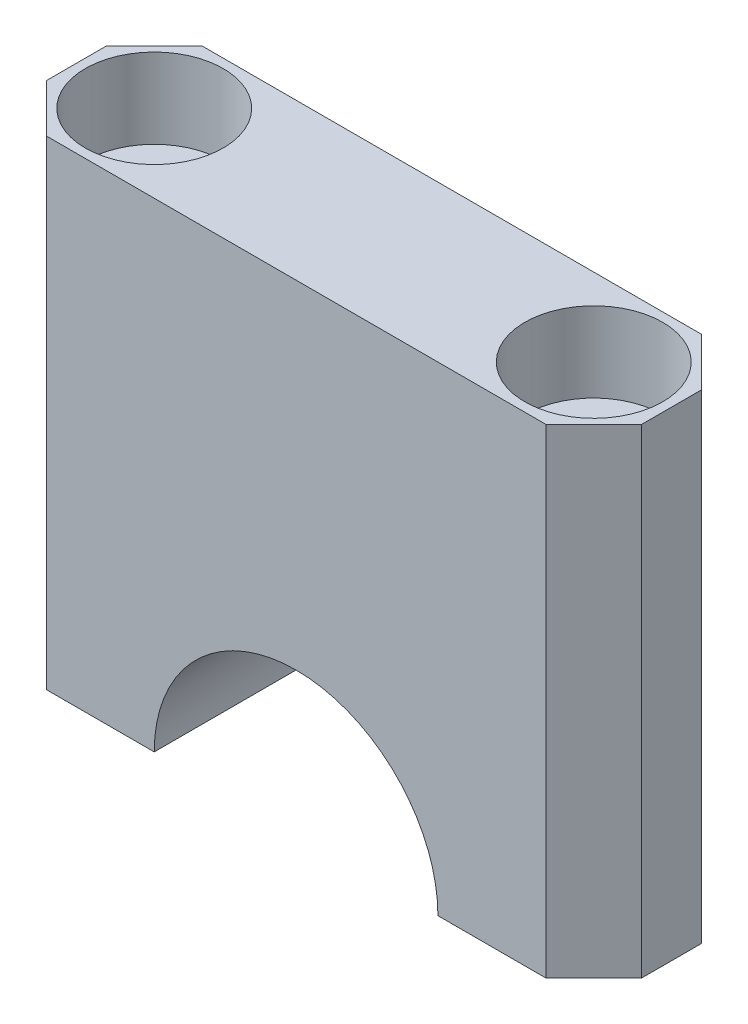
ISO-10303-21;
HEADER;
FILE_DESCRIPTION(('STEP AP214'),'2;1');
FILE_NAME('part.step','',(''),(''),'','','');
FILE_SCHEMA(('AUTOMOTIVE_DESIGN { 1 0 10303 214 1 1 1 1 }'));
ENDSEC;
DATA;
#1=APPLICATION_CONTEXT('core data for automotive mechanical design processes');
#2=APPLICATION_PROTOCOL_DEFINITION('international standard','automotive_design',2000,#1);
#3=PRODUCT_CONTEXT('',#1,'mechanical');
#4=PRODUCT('Part','Part','',(#3));
#5=PRODUCT_RELATED_PRODUCT_CATEGORY('part','',(#4));
#6=PRODUCT_DEFINITION_FORMATION('','',#4);
#7=PRODUCT_DEFINITION_CONTEXT('part definition',#1,'design');
#8=PRODUCT_DEFINITION('design','',#6,#7);
#9=PRODUCT_DEFINITION_SHAPE('','',#8);
#10=(LENGTH_UNIT() NAMED_UNIT(*) SI_UNIT(.MILLI.,.METRE.));
#11=(NAMED_UNIT(*) PLANE_ANGLE_UNIT() SI_UNIT($,.RADIAN.));
#12=(NAMED_UNIT(*) SI_UNIT($,.STERADIAN.) SOLID_ANGLE_UNIT());
#13=UNCERTAINTY_MEASURE_WITH_UNIT(LENGTH_MEASURE(1.E-05),#10,'distance_accuracy_value','');
#14=(GEOMETRIC_REPRESENTATION_CONTEXT(3) GLOBAL_UNCERTAINTY_ASSIGNED_CONTEXT((#13)) GLOBAL_UNIT_ASSIGNED_CONTEXT((#10,
#11,#12)) REPRESENTATION_CONTEXT('',''));
#15=CARTESIAN_POINT('',(0.,0.,0.));
#16=DIRECTION('',(0.,0.,1.));
#17=DIRECTION('',(1.,0.,0.));
#18=AXIS2_PLACEMENT_3D('',#15,#16,#17);
#19=CARTESIAN_POINT('',(-11.,-24.,0.));
#20=DIRECTION('',(0.,1.,0.));
#21=DIRECTION('',(0.,0.,1.));
#22=AXIS2_PLACEMENT_3D('',#19,#20,#21);
#23=CYLINDRICAL_SURFACE('',#22,2.1);
#24=CARTESIAN_POINT('',(-11.,-24.,0.));
#25=DIRECTION('',(0.,1.,0.));
#26=DIRECTION('',(0.,0.,1.));
#27=AXIS2_PLACEMENT_3D('',#24,#25,#26);
#28=CIRCLE('',#27,2.1);
#29=CARTESIAN_POINT('',(-11.,-24.,2.1));
#30=VERTEX_POINT('',#29);
#31=EDGE_CURVE('E155',#30,#30,#28,.T.);
#32=ORIENTED_EDGE('',*,*,#31,.F.);
#33=EDGE_LOOP('',(#32));
#34=FACE_BOUND('',#33,.T.);
#35=CARTESIAN_POINT('',(-11.,-4.,0.));
#36=DIRECTION('',(0.,1.,0.));
#37=DIRECTION('',(0.,0.,1.));
#38=AXIS2_PLACEMENT_3D('',#35,#36,#37);
#39=CIRCLE('',#38,2.1);
#40=CARTESIAN_POINT('',(-11.,-4.,2.1));
#41=VERTEX_POINT('',#40);
#42=EDGE_CURVE('E41',#41,#41,#39,.F.);
#43=ORIENTED_EDGE('',*,*,#42,.F.);
#44=EDGE_LOOP('',(#43));
#45=FACE_BOUND('',#44,.T.);
#46=ADVANCED_FACE('F37',(#34,#45),#23,.F.);
#47=CARTESIAN_POINT('',(0.,-24.,0.));
#48=DIRECTION('',(0.,-1.,0.));
#49=DIRECTION('',(0.,0.,-1.));
#50=AXIS2_PLACEMENT_3D('',#47,#48,#49);
#51=PLANE('',#50);
#52=DIRECTION('',(0.,0.,-1.));
#53=VECTOR('',#52,1.);
#54=CARTESIAN_POINT('',(-7.1,-24.,3.90100000000002));
#55=LINE('',#54,#53);
#56=CARTESIAN_POINT('',(-7.1,-24.,3.90000000000001));
#57=VERTEX_POINT('',#56);
#58=CARTESIAN_POINT('',(-7.1,-24.,-3.9));
#59=VERTEX_POINT('',#58);
#60=EDGE_CURVE('E205',#57,#59,#55,.T.);
#61=ORIENTED_EDGE('',*,*,#60,.F.);
#62=DIRECTION('',(1.,0.,0.));
#63=VECTOR('',#62,1.);
#64=CARTESIAN_POINT('',(12.5,-24.,3.90000000000001));
#65=LINE('',#64,#63);
#66=CARTESIAN_POINT('',(-12.5,-24.,3.90000000000002));
#67=VERTEX_POINT('',#66);
#68=EDGE_CURVE('E213',#67,#57,#65,.T.);
#69=ORIENTED_EDGE('',*,*,#68,.F.);
#70=DIRECTION('',(0.707106781186545,0.,0.70710678118655));
#71=VECTOR('',#70,1.);
#72=CARTESIAN_POINT('',(-14.9,-24.,1.5));
#73=LINE('',#72,#71);
#74=CARTESIAN_POINT('',(-14.9,-24.,1.5));
#75=VERTEX_POINT('',#74);
#76=EDGE_CURVE('E138',#75,#67,#73,.T.);
#77=ORIENTED_EDGE('',*,*,#76,.F.);
#78=DIRECTION('',(0.,0.,1.));
#79=VECTOR('',#78,1.);
#80=CARTESIAN_POINT('',(-14.9,-24.,1.5));
#81=LINE('',#80,#79);
#82=CARTESIAN_POINT('',(-14.9,-24.,-1.5));
#83=VERTEX_POINT('',#82);
#84=EDGE_CURVE('E121',#83,#75,#81,.T.);
#85=ORIENTED_EDGE('',*,*,#84,.F.);
#86=DIRECTION('',(-0.707106781186547,0.,0.707106781186548));
#87=VECTOR('',#86,1.);
#88=CARTESIAN_POINT('',(-14.9,-24.,-1.5));
#89=LINE('',#88,#87);
#90=CARTESIAN_POINT('',(-12.5,-24.,-3.9));
#91=VERTEX_POINT('',#90);
#92=EDGE_CURVE('E137',#91,#83,#89,.T.);
#93=ORIENTED_EDGE('',*,*,#92,.F.);
#94=DIRECTION('',(-1.,0.,0.));
#95=VECTOR('',#94,1.);
#96=CARTESIAN_POINT('',(12.5,-24.,-3.90000000000001));
#97=LINE('',#96,#95);
#98=EDGE_CURVE('E145',#59,#91,#97,.T.);
#99=ORIENTED_EDGE('',*,*,#98,.F.);
#100=EDGE_LOOP('',(#61,#69,#77,#85,#93,#99));
#101=FACE_BOUND('',#100,.T.);
#102=ORIENTED_EDGE('',*,*,#31,.T.);
#103=EDGE_LOOP('',(#102));
#104=FACE_BOUND('',#103,.T.);
#105=ADVANCED_FACE('F134',(#101,#104),#51,.T.);
#106=CARTESIAN_POINT('',(12.5,-24.,3.90000000000001));
#107=DIRECTION('',(0.,0.,1.));
#108=DIRECTION('',(1.,0.,0.));
#109=AXIS2_PLACEMENT_3D('',#106,#107,#108);
#110=PLANE('',#109);
#111=CARTESIAN_POINT('',(0.,-24.,3.90000000000001));
#112=DIRECTION('',(0.,0.,1.));
#113=DIRECTION('',(1.,0.,0.));
#114=AXIS2_PLACEMENT_3D('',#111,#112,#113);
#115=CIRCLE('',#114,7.1);
#116=CARTESIAN_POINT('',(7.1,-24.,3.90000000000001));
#117=VERTEX_POINT('',#116);
#118=EDGE_CURVE('E187',#57,#117,#115,.F.);
#119=ORIENTED_EDGE('',*,*,#118,.T.);
#120=CARTESIAN_POINT('',(12.5,-24.,3.90000000000001));
#121=VERTEX_POINT('',#120);
#122=EDGE_CURVE('E99',#117,#121,#65,.T.);
#123=ORIENTED_EDGE('',*,*,#122,.T.);
#124=DIRECTION('',(0.,1.,0.));
#125=VECTOR('',#124,1.);
#126=CARTESIAN_POINT('',(12.5,-24.,3.90000000000001));
#127=LINE('',#126,#125);
#128=CARTESIAN_POINT('',(12.5,0.,3.90000000000001));
#129=VERTEX_POINT('',#128);
#130=EDGE_CURVE('E150',#121,#129,#127,.T.);
#131=ORIENTED_EDGE('',*,*,#130,.T.);
#132=DIRECTION('',(1.,0.,0.));
#133=VECTOR('',#132,1.);
#134=CARTESIAN_POINT('',(12.5,0.,3.90000000000001));
#135=LINE('',#134,#133);
#136=CARTESIAN_POINT('',(-12.5,0.,3.90000000000002));
#137=VERTEX_POINT('',#136);
#138=EDGE_CURVE('E151',#137,#129,#135,.T.);
#139=ORIENTED_EDGE('',*,*,#138,.F.);
#140=DIRECTION('',(0.,1.,0.));
#141=VECTOR('',#140,1.);
#142=CARTESIAN_POINT('',(-12.5,-24.,3.90000000000002));
#143=LINE('',#142,#141);
#144=EDGE_CURVE('E11',#67,#137,#143,.T.);
#145=ORIENTED_EDGE('',*,*,#144,.F.);
#146=ORIENTED_EDGE('',*,*,#68,.T.);
#147=EDGE_LOOP('',(#119,#123,#131,#139,#145,#146));
#148=FACE_BOUND('',#147,.T.);
#149=ADVANCED_FACE('F39',(#148),#110,.T.);
#150=CARTESIAN_POINT('',(-14.9,-24.,1.5));
#151=DIRECTION('',(-0.707106781186549,0.,0.707106781186545));
#152=DIRECTION('',(0.707106781186545,0.,0.70710678118655));
#153=AXIS2_PLACEMENT_3D('',#150,#151,#152);
#154=PLANE('',#153);
#155=DIRECTION('',(0.707106781186545,0.,0.70710678118655));
#156=VECTOR('',#155,1.);
#157=CARTESIAN_POINT('',(-14.9,0.,1.5));
#158=LINE('',#157,#156);
#159=CARTESIAN_POINT('',(-14.9,0.,1.5));
#160=VERTEX_POINT('',#159);
#161=EDGE_CURVE('E170',#160,#137,#158,.T.);
#162=ORIENTED_EDGE('',*,*,#161,.F.);
#163=DIRECTION('',(0.,1.,0.));
#164=VECTOR('',#163,1.);
#165=CARTESIAN_POINT('',(-14.9,-24.,1.5));
#166=LINE('',#165,#164);
#167=EDGE_CURVE('E46',#75,#160,#166,.T.);
#168=ORIENTED_EDGE('',*,*,#167,.F.);
#169=ORIENTED_EDGE('',*,*,#76,.T.);
#170=ORIENTED_EDGE('',*,*,#144,.T.);
#171=EDGE_LOOP('',(#162,#168,#169,#170));
#172=FACE_BOUND('',#171,.T.);
#173=ADVANCED_FACE('F244',(#172),#154,.T.);
#174=CARTESIAN_POINT('',(-14.9,-24.,1.5));
#175=DIRECTION('',(-1.,0.,0.));
#176=DIRECTION('',(0.,0.,1.));
#177=AXIS2_PLACEMENT_3D('',#174,#175,#176);
#178=PLANE('',#177);
#179=DIRECTION('',(0.,0.,1.));
#180=VECTOR('',#179,1.);
#181=CARTESIAN_POINT('',(-14.9,0.,1.5));
#182=LINE('',#181,#180);
#183=CARTESIAN_POINT('',(-14.9,0.,-1.5));
#184=VERTEX_POINT('',#183);
#185=EDGE_CURVE('E124',#184,#160,#182,.T.);
#186=ORIENTED_EDGE('',*,*,#185,.F.);
#187=DIRECTION('',(0.,1.,0.));
#188=VECTOR('',#187,1.);
#189=CARTESIAN_POINT('',(-14.9,-24.,-1.5));
#190=LINE('',#189,#188);
#191=EDGE_CURVE('E118',#83,#184,#190,.T.);
#192=ORIENTED_EDGE('',*,*,#191,.F.);
#193=ORIENTED_EDGE('',*,*,#84,.T.);
#194=ORIENTED_EDGE('',*,*,#167,.T.);
#195=EDGE_LOOP('',(#186,#192,#193,#194));
#196=FACE_BOUND('',#195,.T.);
#197=ADVANCED_FACE('F120',(#196),#178,.T.);
#198=CARTESIAN_POINT('',(-14.9,-24.,-1.5));
#199=DIRECTION('',(-0.707106781186548,0.,-0.707106781186547));
#200=DIRECTION('',(-0.707106781186547,0.,0.707106781186548));
#201=AXIS2_PLACEMENT_3D('',#198,#199,#200);
#202=PLANE('',#201);
#203=DIRECTION('',(-0.707106781186547,0.,0.707106781186548));
#204=VECTOR('',#203,1.);
#205=CARTESIAN_POINT('',(-14.9,0.,-1.5));
#206=LINE('',#205,#204);
#207=CARTESIAN_POINT('',(-12.5,0.,-3.9));
#208=VERTEX_POINT('',#207);
#209=EDGE_CURVE('E167',#208,#184,#206,.T.);
#210=ORIENTED_EDGE('',*,*,#209,.F.);
#211=DIRECTION('',(0.,1.,0.));
#212=VECTOR('',#211,1.);
#213=CARTESIAN_POINT('',(-12.5,-24.,-3.9));
#214=LINE('',#213,#212);
#215=EDGE_CURVE('E129',#91,#208,#214,.T.);
#216=ORIENTED_EDGE('',*,*,#215,.F.);
#217=ORIENTED_EDGE('',*,*,#92,.T.);
#218=ORIENTED_EDGE('',*,*,#191,.T.);
#219=EDGE_LOOP('',(#210,#216,#217,#218));
#220=FACE_BOUND('',#219,.T.);
#221=ADVANCED_FACE('F141',(#220),#202,.T.);
#222=CARTESIAN_POINT('',(12.5,-24.,-3.90000000000001));
#223=DIRECTION('',(0.,0.,-1.));
#224=DIRECTION('',(-1.,0.,0.));
#225=AXIS2_PLACEMENT_3D('',#222,#223,#224);
#226=PLANE('',#225);
#227=CARTESIAN_POINT('',(0.,-24.,-3.9));
#228=DIRECTION('',(0.,0.,-1.));
#229=DIRECTION('',(-1.,0.,0.));
#230=AXIS2_PLACEMENT_3D('',#227,#228,#229);
#231=CIRCLE('',#230,7.1);
#232=CARTESIAN_POINT('',(7.1,-24.,-3.9));
#233=VERTEX_POINT('',#232);
#234=EDGE_CURVE('E54',#59,#233,#231,.T.);
#235=ORIENTED_EDGE('',*,*,#234,.F.);
#236=ORIENTED_EDGE('',*,*,#98,.T.);
#237=ORIENTED_EDGE('',*,*,#215,.T.);
#238=DIRECTION('',(-1.,0.,0.));
#239=VECTOR('',#238,1.);
#240=CARTESIAN_POINT('',(12.5,0.,-3.90000000000001));
#241=LINE('',#240,#239);
#242=CARTESIAN_POINT('',(12.5,0.,-3.90000000000001));
#243=VERTEX_POINT('',#242);
#244=EDGE_CURVE('E164',#243,#208,#241,.T.);
#245=ORIENTED_EDGE('',*,*,#244,.F.);
#246=DIRECTION('',(0.,1.,0.));
#247=VECTOR('',#246,1.);
#248=CARTESIAN_POINT('',(12.5,-24.,-3.90000000000001));
#249=LINE('',#248,#247);
#250=CARTESIAN_POINT('',(12.5,-24.,-3.90000000000001));
#251=VERTEX_POINT('',#250);
#252=EDGE_CURVE('E175',#251,#243,#249,.T.);
#253=ORIENTED_EDGE('',*,*,#252,.F.);
#254=EDGE_CURVE('E142',#251,#233,#97,.T.);
#255=ORIENTED_EDGE('',*,*,#254,.T.);
#256=EDGE_LOOP('',(#235,#236,#237,#245,#253,#255));
#257=FACE_BOUND('',#256,.T.);
#258=ADVANCED_FACE('F225',(#257),#226,.T.);
#259=CARTESIAN_POINT('',(14.9,-24.,-1.5));
#260=DIRECTION('',(0.707106781186548,0.,-0.707106781186546));
#261=DIRECTION('',(-0.707106781186547,0.,-0.707106781186549));
#262=AXIS2_PLACEMENT_3D('',#259,#260,#261);
#263=PLANE('',#262);
#264=DIRECTION('',(-0.707106781186547,0.,-0.707106781186549));
#265=VECTOR('',#264,1.);
#266=CARTESIAN_POINT('',(14.9,0.,-1.5));
#267=LINE('',#266,#265);
#268=CARTESIAN_POINT('',(14.9,0.,-1.5));
#269=VERTEX_POINT('',#268);
#270=EDGE_CURVE('E161',#269,#243,#267,.T.);
#271=ORIENTED_EDGE('',*,*,#270,.F.);
#272=DIRECTION('',(0.,1.,0.));
#273=VECTOR('',#272,1.);
#274=CARTESIAN_POINT('',(14.9,-24.,-1.5));
#275=LINE('',#274,#273);
#276=CARTESIAN_POINT('',(14.9,-24.,-1.5));
#277=VERTEX_POINT('',#276);
#278=EDGE_CURVE('E177',#277,#269,#275,.T.);
#279=ORIENTED_EDGE('',*,*,#278,.F.);
#280=DIRECTION('',(-0.707106781186547,0.,-0.707106781186549));
#281=VECTOR('',#280,1.);
#282=CARTESIAN_POINT('',(14.9,-24.,-1.5));
#283=LINE('',#282,#281);
#284=EDGE_CURVE('E220',#277,#251,#283,.T.);
#285=ORIENTED_EDGE('',*,*,#284,.T.);
#286=ORIENTED_EDGE('',*,*,#252,.T.);
#287=EDGE_LOOP('',(#271,#279,#285,#286));
#288=FACE_BOUND('',#287,.T.);
#289=ADVANCED_FACE('F361',(#288),#263,.T.);
#290=CARTESIAN_POINT('',(14.9,-24.,-1.5));
#291=DIRECTION('',(1.,0.,0.));
#292=DIRECTION('',(0.,0.,-1.));
#293=AXIS2_PLACEMENT_3D('',#290,#291,#292);
#294=PLANE('',#293);
#295=DIRECTION('',(0.,0.,-1.));
#296=VECTOR('',#295,1.);
#297=CARTESIAN_POINT('',(14.9,0.,-1.5));
#298=LINE('',#297,#296);
#299=CARTESIAN_POINT('',(14.9,0.,1.5));
#300=VERTEX_POINT('',#299);
#301=EDGE_CURVE('E158',#300,#269,#298,.T.);
#302=ORIENTED_EDGE('',*,*,#301,.F.);
#303=DIRECTION('',(0.,1.,0.));
#304=VECTOR('',#303,1.);
#305=CARTESIAN_POINT('',(14.9,-24.,1.5));
#306=LINE('',#305,#304);
#307=CARTESIAN_POINT('',(14.9,-24.,1.5));
#308=VERTEX_POINT('',#307);
#309=EDGE_CURVE('E179',#308,#300,#306,.T.);
#310=ORIENTED_EDGE('',*,*,#309,.F.);
#311=DIRECTION('',(0.,0.,-1.));
#312=VECTOR('',#311,1.);
#313=CARTESIAN_POINT('',(14.9,-24.,-1.5));
#314=LINE('',#313,#312);
#315=EDGE_CURVE('E218',#308,#277,#314,.T.);
#316=ORIENTED_EDGE('',*,*,#315,.T.);
#317=ORIENTED_EDGE('',*,*,#278,.T.);
#318=EDGE_LOOP('',(#302,#310,#316,#317));
#319=FACE_BOUND('',#318,.T.);
#320=ADVANCED_FACE('F376',(#319),#294,.T.);
#321=CARTESIAN_POINT('',(14.9,-24.,1.5));
#322=DIRECTION('',(0.707106781186549,0.,0.707106781186546));
#323=DIRECTION('',(0.707106781186546,0.,-0.707106781186549));
#324=AXIS2_PLACEMENT_3D('',#321,#322,#323);
#325=PLANE('',#324);
#326=DIRECTION('',(0.707106781186546,0.,-0.707106781186549));
#327=VECTOR('',#326,1.);
#328=CARTESIAN_POINT('',(14.9,0.,1.5));
#329=LINE('',#328,#327);
#330=EDGE_CURVE('E154',#129,#300,#329,.T.);
#331=ORIENTED_EDGE('',*,*,#330,.F.);
#332=ORIENTED_EDGE('',*,*,#130,.F.);
#333=DIRECTION('',(0.707106781186546,0.,-0.707106781186549));
#334=VECTOR('',#333,1.);
#335=CARTESIAN_POINT('',(14.9,-24.,1.5));
#336=LINE('',#335,#334);
#337=EDGE_CURVE('E215',#121,#308,#336,.T.);
#338=ORIENTED_EDGE('',*,*,#337,.T.);
#339=ORIENTED_EDGE('',*,*,#309,.T.);
#340=EDGE_LOOP('',(#331,#332,#338,#339));
#341=FACE_BOUND('',#340,.T.);
#342=ADVANCED_FACE('F240',(#341),#325,.T.);
#343=DIRECTION('',(0.,0.,-1.));
#344=VECTOR('',#343,1.);
#345=CARTESIAN_POINT('',(7.1,-24.,3.90100000000002));
#346=LINE('',#345,#344);
#347=EDGE_CURVE('E204',#117,#233,#346,.T.);
#348=ORIENTED_EDGE('',*,*,#347,.T.);
#349=ORIENTED_EDGE('',*,*,#254,.F.);
#350=ORIENTED_EDGE('',*,*,#284,.F.);
#351=ORIENTED_EDGE('',*,*,#315,.F.);
#352=ORIENTED_EDGE('',*,*,#337,.F.);
#353=ORIENTED_EDGE('',*,*,#122,.F.);
#354=EDGE_LOOP('',(#348,#349,#350,#351,#352,#353));
#355=FACE_BOUND('',#354,.T.);
#356=CARTESIAN_POINT('',(11.,-24.,0.));
#357=DIRECTION('',(0.,1.,0.));
#358=DIRECTION('',(0.,0.,-1.));
#359=AXIS2_PLACEMENT_3D('',#356,#357,#358);
#360=CIRCLE('',#359,2.1);
#361=CARTESIAN_POINT('',(11.,-24.,-2.1));
#362=VERTEX_POINT('',#361);
#363=EDGE_CURVE('E207',#362,#362,#360,.T.);
#364=ORIENTED_EDGE('',*,*,#363,.T.);
#365=EDGE_LOOP('',(#364));
#366=FACE_BOUND('',#365,.T.);
#367=ADVANCED_FACE('F235',(#355,#366),#51,.T.);
#368=CARTESIAN_POINT('',(0.,0.,0.));
#369=DIRECTION('',(0.,-1.,0.));
#370=DIRECTION('',(0.,0.,-1.));
#371=AXIS2_PLACEMENT_3D('',#368,#369,#370);
#372=PLANE('',#371);
#373=CARTESIAN_POINT('',(-11.,0.,0.));
#374=DIRECTION('',(0.,1.,0.));
#375=DIRECTION('',(0.,0.,1.));
#376=AXIS2_PLACEMENT_3D('',#373,#374,#375);
#377=CIRCLE('',#376,3.45);
#378=CARTESIAN_POINT('',(-11.,0.,3.45));
#379=VERTEX_POINT('',#378);
#380=EDGE_CURVE('E189',#379,#379,#377,.T.);
#381=ORIENTED_EDGE('',*,*,#380,.F.);
#382=EDGE_LOOP('',(#381));
#383=FACE_BOUND('',#382,.T.);
#384=CARTESIAN_POINT('',(11.,0.,0.));
#385=DIRECTION('',(0.,1.,0.));
#386=DIRECTION('',(0.,0.,-1.));
#387=AXIS2_PLACEMENT_3D('',#384,#385,#386);
#388=CIRCLE('',#387,3.45);
#389=CARTESIAN_POINT('',(11.,0.,-3.45));
#390=VERTEX_POINT('',#389);
#391=EDGE_CURVE('E199',#390,#390,#388,.T.);
#392=ORIENTED_EDGE('',*,*,#391,.F.);
#393=EDGE_LOOP('',(#392));
#394=FACE_BOUND('',#393,.T.);
#395=ORIENTED_EDGE('',*,*,#138,.T.);
#396=ORIENTED_EDGE('',*,*,#330,.T.);
#397=ORIENTED_EDGE('',*,*,#301,.T.);
#398=ORIENTED_EDGE('',*,*,#270,.T.);
#399=ORIENTED_EDGE('',*,*,#244,.T.);
#400=ORIENTED_EDGE('',*,*,#209,.T.);
#401=ORIENTED_EDGE('',*,*,#185,.T.);
#402=ORIENTED_EDGE('',*,*,#161,.T.);
#403=EDGE_LOOP('',(#395,#396,#397,#398,#399,#400,#401,#402));
#404=FACE_BOUND('',#403,.T.);
#405=ADVANCED_FACE('F243',(#383,#394,#404),#372,.F.);
#406=CARTESIAN_POINT('',(11.,-24.,0.));
#407=DIRECTION('',(0.,1.,0.));
#408=DIRECTION('',(0.,0.,1.));
#409=AXIS2_PLACEMENT_3D('',#406,#407,#408);
#410=CYLINDRICAL_SURFACE('',#409,2.1);
#411=CARTESIAN_POINT('',(11.,-4.,0.));
#412=DIRECTION('',(0.,-1.,0.));
#413=DIRECTION('',(0.,0.,-1.));
#414=AXIS2_PLACEMENT_3D('',#411,#412,#413);
#415=CIRCLE('',#414,2.1);
#416=CARTESIAN_POINT('',(11.,-4.,-2.1));
#417=VERTEX_POINT('',#416);
#418=EDGE_CURVE('E181',#417,#417,#415,.F.);
#419=ORIENTED_EDGE('',*,*,#418,.T.);
#420=EDGE_LOOP('',(#419));
#421=FACE_BOUND('',#420,.T.);
#422=ORIENTED_EDGE('',*,*,#363,.F.);
#423=EDGE_LOOP('',(#422));
#424=FACE_BOUND('',#423,.T.);
#425=ADVANCED_FACE('F263',(#421,#424),#410,.F.);
#426=CARTESIAN_POINT('',(0.,-24.,3.90100000000002));
#427=DIRECTION('',(0.,0.,-1.));
#428=DIRECTION('',(-1.,0.,0.));
#429=AXIS2_PLACEMENT_3D('',#426,#427,#428);
#430=CYLINDRICAL_SURFACE('',#429,7.1);
#431=ORIENTED_EDGE('',*,*,#60,.T.);
#432=ORIENTED_EDGE('',*,*,#234,.T.);
#433=ORIENTED_EDGE('',*,*,#347,.F.);
#434=ORIENTED_EDGE('',*,*,#118,.F.);
#435=EDGE_LOOP('',(#431,#432,#433,#434));
#436=FACE_BOUND('',#435,.T.);
#437=ADVANCED_FACE('F231',(#436),#430,.F.);
#438=CARTESIAN_POINT('',(11.,-4.,0.));
#439=DIRECTION('',(0.,-1.,0.));
#440=DIRECTION('',(0.,0.,-1.));
#441=AXIS2_PLACEMENT_3D('',#438,#439,#440);
#442=PLANE('',#441);
#443=CARTESIAN_POINT('',(11.,-4.,0.));
#444=DIRECTION('',(0.,1.,0.));
#445=DIRECTION('',(0.,0.,-1.));
#446=AXIS2_PLACEMENT_3D('',#443,#444,#445);
#447=CIRCLE('',#446,3.45);
#448=CARTESIAN_POINT('',(11.,-4.,-3.45));
#449=VERTEX_POINT('',#448);
#450=EDGE_CURVE('E194',#449,#449,#447,.T.);
#451=ORIENTED_EDGE('',*,*,#450,.T.);
#452=EDGE_LOOP('',(#451));
#453=FACE_BOUND('',#452,.T.);
#454=ORIENTED_EDGE('',*,*,#418,.F.);
#455=EDGE_LOOP('',(#454));
#456=FACE_BOUND('',#455,.T.);
#457=ADVANCED_FACE('F278',(#453,#456),#442,.F.);
#458=CARTESIAN_POINT('',(11.,-4.,0.));
#459=DIRECTION('',(0.,1.,0.));
#460=DIRECTION('',(0.,0.,1.));
#461=AXIS2_PLACEMENT_3D('',#458,#459,#460);
#462=CYLINDRICAL_SURFACE('',#461,3.45);
#463=ORIENTED_EDGE('',*,*,#450,.F.);
#464=EDGE_LOOP('',(#463));
#465=FACE_BOUND('',#464,.T.);
#466=ORIENTED_EDGE('',*,*,#391,.T.);
#467=EDGE_LOOP('',(#466));
#468=FACE_BOUND('',#467,.T.);
#469=ADVANCED_FACE('F275',(#465,#468),#462,.F.);
#470=CARTESIAN_POINT('',(-11.,-4.,0.));
#471=DIRECTION('',(0.,1.,0.));
#472=DIRECTION('',(0.,0.,1.));
#473=AXIS2_PLACEMENT_3D('',#470,#471,#472);
#474=PLANE('',#473);
#475=CARTESIAN_POINT('',(-11.,-4.,0.));
#476=DIRECTION('',(0.,1.,0.));
#477=DIRECTION('',(0.,0.,1.));
#478=AXIS2_PLACEMENT_3D('',#475,#476,#477);
#479=CIRCLE('',#478,3.45);
#480=CARTESIAN_POINT('',(-11.,-4.,3.45));
#481=VERTEX_POINT('',#480);
#482=EDGE_CURVE('E183',#481,#481,#479,.T.);
#483=ORIENTED_EDGE('',*,*,#482,.T.);
#484=EDGE_LOOP('',(#483));
#485=FACE_BOUND('',#484,.T.);
#486=ORIENTED_EDGE('',*,*,#42,.T.);
#487=EDGE_LOOP('',(#486));
#488=FACE_BOUND('',#487,.T.);
#489=ADVANCED_FACE('F277',(#485,#488),#474,.T.);
#490=CARTESIAN_POINT('',(-11.,-4.,0.));
#491=DIRECTION('',(0.,1.,0.));
#492=DIRECTION('',(0.,0.,1.));
#493=AXIS2_PLACEMENT_3D('',#490,#491,#492);
#494=CYLINDRICAL_SURFACE('',#493,3.45);
#495=ORIENTED_EDGE('',*,*,#482,.F.);
#496=EDGE_LOOP('',(#495));
#497=FACE_BOUND('',#496,.T.);
#498=ORIENTED_EDGE('',*,*,#380,.T.);
#499=EDGE_LOOP('',(#498));
#500=FACE_BOUND('',#499,.T.);
#501=ADVANCED_FACE('F285',(#497,#500),#494,.F.);
#502=CLOSED_SHELL('',(#46,#105,#149,#173,#197,#221,#258,#289,#320,#342,#367,#405,#425,#437,#457,
#469,#489,#501));
#503=MANIFOLD_SOLID_BREP('B2',#502);
#504=ADVANCED_BREP_SHAPE_REPRESENTATION('',(#18,#503),#14);
#505=SHAPE_DEFINITION_REPRESENTATION(#9,#504);
ENDSEC;
END-ISO-10303-21;
